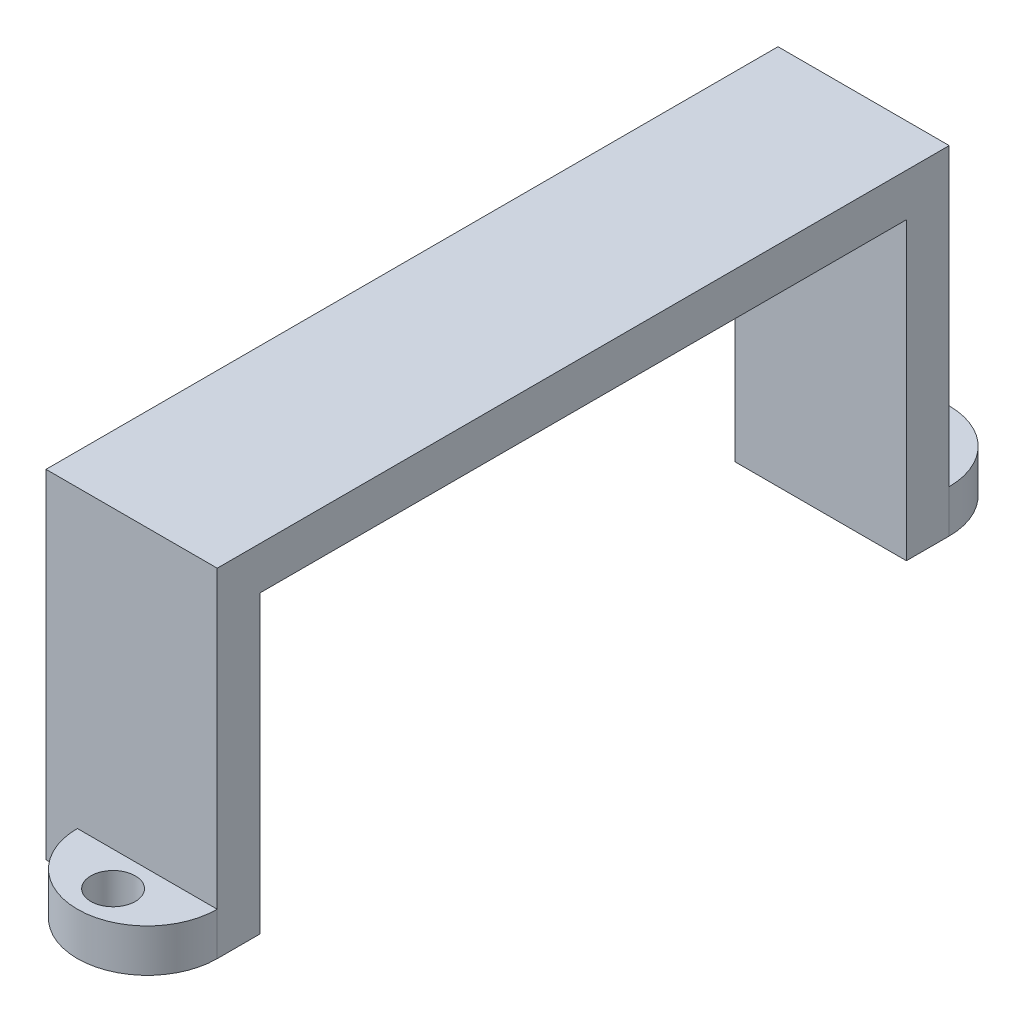
ISO-10303-21;
HEADER;
FILE_DESCRIPTION(('STEP AP214'),'2;1');
FILE_NAME('part.step','',(''),(''),'','','');
FILE_SCHEMA(('AUTOMOTIVE_DESIGN { 1 0 10303 214 1 1 1 1 }'));
ENDSEC;
DATA;
#1=APPLICATION_CONTEXT('core data for automotive mechanical design processes');
#2=APPLICATION_PROTOCOL_DEFINITION('international standard','automotive_design',2000,#1);
#3=PRODUCT_CONTEXT('',#1,'mechanical');
#4=PRODUCT('Part','Part','',(#3));
#5=PRODUCT_RELATED_PRODUCT_CATEGORY('part','',(#4));
#6=PRODUCT_DEFINITION_FORMATION('','',#4);
#7=PRODUCT_DEFINITION_CONTEXT('part definition',#1,'design');
#8=PRODUCT_DEFINITION('design','',#6,#7);
#9=PRODUCT_DEFINITION_SHAPE('','',#8);
#10=(LENGTH_UNIT() NAMED_UNIT(*) SI_UNIT(.MILLI.,.METRE.));
#11=(NAMED_UNIT(*) PLANE_ANGLE_UNIT() SI_UNIT($,.RADIAN.));
#12=(NAMED_UNIT(*) SI_UNIT($,.STERADIAN.) SOLID_ANGLE_UNIT());
#13=UNCERTAINTY_MEASURE_WITH_UNIT(LENGTH_MEASURE(1.E-05),#10,'distance_accuracy_value','');
#14=(GEOMETRIC_REPRESENTATION_CONTEXT(3) GLOBAL_UNCERTAINTY_ASSIGNED_CONTEXT((#13)) GLOBAL_UNIT_ASSIGNED_CONTEXT((#10,
#11,#12)) REPRESENTATION_CONTEXT('',''));
#15=CARTESIAN_POINT('',(0.,0.,0.));
#16=DIRECTION('',(0.,0.,1.));
#17=DIRECTION('',(1.,0.,0.));
#18=AXIS2_PLACEMENT_3D('',#15,#16,#17);
#19=CARTESIAN_POINT('',(0.,17.526,0.));
#20=DIRECTION('',(0.,1.,0.));
#21=DIRECTION('',(0.,0.,1.));
#22=AXIS2_PLACEMENT_3D('',#19,#20,#21);
#23=PLANE('',#22);
#24=DIRECTION('',(-1.,0.,0.));
#25=VECTOR('',#24,1.);
#26=CARTESIAN_POINT('',(-24.2495294117647,17.526,25.0712941176471));
#27=LINE('',#26,#25);
#28=CARTESIAN_POINT('',(-14.0895294117647,17.526,25.0712941176471));
#29=VERTEX_POINT('',#28);
#30=CARTESIAN_POINT('',(-24.2495294117647,17.526,25.0712941176471));
#31=VERTEX_POINT('',#30);
#32=EDGE_CURVE('E170',#29,#31,#27,.T.);
#33=ORIENTED_EDGE('',*,*,#32,.T.);
#34=DIRECTION('',(0.,0.,1.));
#35=VECTOR('',#34,1.);
#36=CARTESIAN_POINT('',(-24.2495294117647,17.526,-15.8227058823529));
#37=LINE('',#36,#35);
#38=CARTESIAN_POINT('',(-24.2495294117647,17.526,-13.2827058823529));
#39=VERTEX_POINT('',#38);
#40=EDGE_CURVE('E187',#39,#31,#37,.T.);
#41=ORIENTED_EDGE('',*,*,#40,.F.);
#42=DIRECTION('',(1.,0.,0.));
#43=VECTOR('',#42,1.);
#44=CARTESIAN_POINT('',(-24.2495294117647,17.526,-13.2827058823529));
#45=LINE('',#44,#43);
#46=CARTESIAN_POINT('',(-14.0895294117647,17.526,-13.2827058823529));
#47=VERTEX_POINT('',#46);
#48=EDGE_CURVE('E129',#39,#47,#45,.T.);
#49=ORIENTED_EDGE('',*,*,#48,.T.);
#50=DIRECTION('',(0.,0.,-1.));
#51=VECTOR('',#50,1.);
#52=CARTESIAN_POINT('',(-14.0895294117647,17.526,-15.8227058823529));
#53=LINE('',#52,#51);
#54=EDGE_CURVE('E37',#29,#47,#53,.T.);
#55=ORIENTED_EDGE('',*,*,#54,.F.);
#56=EDGE_LOOP('',(#33,#41,#49,#55));
#57=FACE_BOUND('',#56,.T.);
#58=ADVANCED_FACE('F33',(#57),#23,.F.);
#59=CARTESIAN_POINT('',(-24.2495294117647,17.526,-15.8227058823529));
#60=DIRECTION('',(1.,0.,0.));
#61=DIRECTION('',(0.,0.,-1.));
#62=AXIS2_PLACEMENT_3D('',#59,#60,#61);
#63=PLANE('',#62);
#64=DIRECTION('',(0.,0.,1.));
#65=VECTOR('',#64,1.);
#66=CARTESIAN_POINT('',(-24.2495294117647,0.,-15.8227058823529));
#67=LINE('',#66,#65);
#68=CARTESIAN_POINT('',(-24.2495294117647,0.,-15.8227058823529));
#69=VERTEX_POINT('',#68);
#70=CARTESIAN_POINT('',(-24.2495294117647,0.,-13.2827058823529));
#71=VERTEX_POINT('',#70);
#72=EDGE_CURVE('E127',#69,#71,#67,.T.);
#73=ORIENTED_EDGE('',*,*,#72,.T.);
#74=DIRECTION('',(0.,-1.,0.));
#75=VECTOR('',#74,1.);
#76=CARTESIAN_POINT('',(-24.2495294117647,17.526,-13.2827058823529));
#77=LINE('',#76,#75);
#78=EDGE_CURVE('E11',#39,#71,#77,.T.);
#79=ORIENTED_EDGE('',*,*,#78,.F.);
#80=ORIENTED_EDGE('',*,*,#40,.T.);
#81=DIRECTION('',(0.,-1.,0.));
#82=VECTOR('',#81,1.);
#83=CARTESIAN_POINT('',(-24.2495294117647,17.526,25.0712941176471));
#84=LINE('',#83,#82);
#85=CARTESIAN_POINT('',(-24.2495294117647,0.,25.0712941176471));
#86=VERTEX_POINT('',#85);
#87=EDGE_CURVE('E173',#31,#86,#84,.T.);
#88=ORIENTED_EDGE('',*,*,#87,.T.);
#89=DIRECTION('',(0.,0.,1.));
#90=VECTOR('',#89,1.);
#91=CARTESIAN_POINT('',(-24.2495294117647,0.,25.0712941176471));
#92=LINE('',#91,#90);
#93=CARTESIAN_POINT('',(-24.2495294117647,0.,27.6112941176471));
#94=VERTEX_POINT('',#93);
#95=EDGE_CURVE('E167',#86,#94,#92,.T.);
#96=ORIENTED_EDGE('',*,*,#95,.T.);
#97=DIRECTION('',(0.,-1.,0.));
#98=VECTOR('',#97,1.);
#99=CARTESIAN_POINT('',(-24.2495294117647,20.066,27.6112941176471));
#100=LINE('',#99,#98);
#101=CARTESIAN_POINT('',(-24.2495294117647,20.066,27.6112941176471));
#102=VERTEX_POINT('',#101);
#103=EDGE_CURVE('E207',#102,#94,#100,.T.);
#104=ORIENTED_EDGE('',*,*,#103,.F.);
#105=DIRECTION('',(0.,0.,1.));
#106=VECTOR('',#105,1.);
#107=CARTESIAN_POINT('',(-24.2495294117647,20.066,-15.8227058823529));
#108=LINE('',#107,#106);
#109=CARTESIAN_POINT('',(-24.2495294117647,20.066,-15.8227058823529));
#110=VERTEX_POINT('',#109);
#111=EDGE_CURVE('E188',#110,#102,#108,.T.);
#112=ORIENTED_EDGE('',*,*,#111,.F.);
#113=DIRECTION('',(0.,-1.,0.));
#114=VECTOR('',#113,1.);
#115=CARTESIAN_POINT('',(-24.2495294117647,17.526,-15.8227058823529));
#116=LINE('',#115,#114);
#117=EDGE_CURVE('E214',#110,#69,#116,.T.);
#118=ORIENTED_EDGE('',*,*,#117,.T.);
#119=EDGE_LOOP('',(#73,#79,#80,#88,#96,#104,#112,#118));
#120=FACE_BOUND('',#119,.T.);
#121=ADVANCED_FACE('F35',(#120),#63,.F.);
#122=CARTESIAN_POINT('',(-24.2495294117647,17.526,-13.2827058823529));
#123=DIRECTION('',(0.,0.,-1.));
#124=DIRECTION('',(-1.,0.,0.));
#125=AXIS2_PLACEMENT_3D('',#122,#123,#124);
#126=PLANE('',#125);
#127=DIRECTION('',(1.,0.,0.));
#128=VECTOR('',#127,1.);
#129=CARTESIAN_POINT('',(-24.2495294117647,0.,-13.2827058823529));
#130=LINE('',#129,#128);
#131=CARTESIAN_POINT('',(-14.0895294117647,0.,-13.2827058823529));
#132=VERTEX_POINT('',#131);
#133=EDGE_CURVE('E223',#71,#132,#130,.T.);
#134=ORIENTED_EDGE('',*,*,#133,.T.);
#135=DIRECTION('',(0.,-1.,0.));
#136=VECTOR('',#135,1.);
#137=CARTESIAN_POINT('',(-14.0895294117647,17.526,-13.2827058823529));
#138=LINE('',#137,#136);
#139=EDGE_CURVE('E43',#47,#132,#138,.T.);
#140=ORIENTED_EDGE('',*,*,#139,.F.);
#141=ORIENTED_EDGE('',*,*,#48,.F.);
#142=ORIENTED_EDGE('',*,*,#78,.T.);
#143=EDGE_LOOP('',(#134,#140,#141,#142));
#144=FACE_BOUND('',#143,.T.);
#145=ADVANCED_FACE('F255',(#144),#126,.F.);
#146=CARTESIAN_POINT('',(-14.0895294117647,17.526,-15.8227058823529));
#147=DIRECTION('',(-1.,0.,0.));
#148=DIRECTION('',(0.,0.,1.));
#149=AXIS2_PLACEMENT_3D('',#146,#147,#148);
#150=PLANE('',#149);
#151=DIRECTION('',(0.,0.,-1.));
#152=VECTOR('',#151,1.);
#153=CARTESIAN_POINT('',(-14.0895294117647,0.,-15.8227058823529));
#154=LINE('',#153,#152);
#155=CARTESIAN_POINT('',(-14.0895294117647,0.,-15.8227058823529));
#156=VERTEX_POINT('',#155);
#157=EDGE_CURVE('E130',#132,#156,#154,.T.);
#158=ORIENTED_EDGE('',*,*,#157,.T.);
#159=DIRECTION('',(0.,-1.,0.));
#160=VECTOR('',#159,1.);
#161=CARTESIAN_POINT('',(-14.0895294117647,2.54,-15.8227058823529));
#162=LINE('',#161,#160);
#163=CARTESIAN_POINT('',(-14.0895294117647,2.54,-15.8227058823529));
#164=VERTEX_POINT('',#163);
#165=EDGE_CURVE('E59',#164,#156,#162,.T.);
#166=ORIENTED_EDGE('',*,*,#165,.F.);
#167=DIRECTION('',(0.,-1.,0.));
#168=VECTOR('',#167,1.);
#169=CARTESIAN_POINT('',(-14.0895294117647,17.526,-15.8227058823529));
#170=LINE('',#169,#168);
#171=CARTESIAN_POINT('',(-14.0895294117647,20.066,-15.8227058823529));
#172=VERTEX_POINT('',#171);
#173=EDGE_CURVE('E220',#172,#164,#170,.T.);
#174=ORIENTED_EDGE('',*,*,#173,.F.);
#175=DIRECTION('',(0.,0.,-1.));
#176=VECTOR('',#175,1.);
#177=CARTESIAN_POINT('',(-14.0895294117647,20.066,-15.8227058823529));
#178=LINE('',#177,#176);
#179=CARTESIAN_POINT('',(-14.0895294117647,20.066,27.6112941176471));
#180=VERTEX_POINT('',#179);
#181=EDGE_CURVE('E193',#180,#172,#178,.T.);
#182=ORIENTED_EDGE('',*,*,#181,.F.);
#183=DIRECTION('',(0.,-1.,0.));
#184=VECTOR('',#183,1.);
#185=CARTESIAN_POINT('',(-14.0895294117647,20.066,27.6112941176471));
#186=LINE('',#185,#184);
#187=CARTESIAN_POINT('',(-14.0895294117647,2.54,27.6112941176471));
#188=VERTEX_POINT('',#187);
#189=EDGE_CURVE('E199',#180,#188,#186,.T.);
#190=ORIENTED_EDGE('',*,*,#189,.T.);
#191=DIRECTION('',(0.,-1.,0.));
#192=VECTOR('',#191,1.);
#193=CARTESIAN_POINT('',(-14.0895294117647,2.54,27.6112941176471));
#194=LINE('',#193,#192);
#195=CARTESIAN_POINT('',(-14.0895294117647,0.,27.6112941176471));
#196=VERTEX_POINT('',#195);
#197=EDGE_CURVE('E164',#188,#196,#194,.T.);
#198=ORIENTED_EDGE('',*,*,#197,.T.);
#199=DIRECTION('',(0.,0.,-1.));
#200=VECTOR('',#199,1.);
#201=CARTESIAN_POINT('',(-14.0895294117647,0.,25.0712941176471));
#202=LINE('',#201,#200);
#203=CARTESIAN_POINT('',(-14.0895294117647,0.,25.0712941176471));
#204=VERTEX_POINT('',#203);
#205=EDGE_CURVE('E179',#196,#204,#202,.T.);
#206=ORIENTED_EDGE('',*,*,#205,.T.);
#207=DIRECTION('',(0.,-1.,0.));
#208=VECTOR('',#207,1.);
#209=CARTESIAN_POINT('',(-14.0895294117647,17.526,25.0712941176471));
#210=LINE('',#209,#208);
#211=EDGE_CURVE('E184',#29,#204,#210,.T.);
#212=ORIENTED_EDGE('',*,*,#211,.F.);
#213=ORIENTED_EDGE('',*,*,#54,.T.);
#214=ORIENTED_EDGE('',*,*,#139,.T.);
#215=EDGE_LOOP('',(#158,#166,#174,#182,#190,#198,#206,#212,#213,#214));
#216=FACE_BOUND('',#215,.T.);
#217=ADVANCED_FACE('F235',(#216),#150,.F.);
#218=CARTESIAN_POINT('',(-24.2495294117647,17.526,-15.8227058823529));
#219=DIRECTION('',(0.,0.,1.));
#220=DIRECTION('',(1.,0.,0.));
#221=AXIS2_PLACEMENT_3D('',#218,#219,#220);
#222=PLANE('',#221);
#223=DIRECTION('',(-1.,0.,0.));
#224=VECTOR('',#223,1.);
#225=CARTESIAN_POINT('',(-22.3866283737024,2.54,-15.8227058823529));
#226=LINE('',#225,#224);
#227=CARTESIAN_POINT('',(-22.3866283737024,2.54,-15.8227058823529));
#228=VERTEX_POINT('',#227);
#229=EDGE_CURVE('E51',#164,#228,#226,.T.);
#230=ORIENTED_EDGE('',*,*,#229,.T.);
#231=DIRECTION('',(0.,-1.,0.));
#232=VECTOR('',#231,1.);
#233=CARTESIAN_POINT('',(-22.3866283737024,2.54,-15.8227058823529));
#234=LINE('',#233,#232);
#235=CARTESIAN_POINT('',(-22.3866283737024,0.,-15.8227058823529));
#236=VERTEX_POINT('',#235);
#237=EDGE_CURVE('E132',#228,#236,#234,.T.);
#238=ORIENTED_EDGE('',*,*,#237,.T.);
#239=DIRECTION('',(-1.,0.,0.));
#240=VECTOR('',#239,1.);
#241=CARTESIAN_POINT('',(-24.2495294117647,0.,-15.8227058823529));
#242=LINE('',#241,#240);
#243=EDGE_CURVE('E120',#236,#69,#242,.T.);
#244=ORIENTED_EDGE('',*,*,#243,.T.);
#245=ORIENTED_EDGE('',*,*,#117,.F.);
#246=DIRECTION('',(-1.,0.,0.));
#247=VECTOR('',#246,1.);
#248=CARTESIAN_POINT('',(-24.2495294117647,20.066,-15.8227058823529));
#249=LINE('',#248,#247);
#250=EDGE_CURVE('E196',#172,#110,#249,.T.);
#251=ORIENTED_EDGE('',*,*,#250,.F.);
#252=ORIENTED_EDGE('',*,*,#173,.T.);
#253=EDGE_LOOP('',(#230,#238,#244,#245,#251,#252));
#254=FACE_BOUND('',#253,.T.);
#255=ADVANCED_FACE('F133',(#254),#222,.F.);
#256=CARTESIAN_POINT('',(0.,0.,0.));
#257=DIRECTION('',(0.,1.,0.));
#258=DIRECTION('',(0.,0.,1.));
#259=AXIS2_PLACEMENT_3D('',#256,#257,#258);
#260=PLANE('',#259);
#261=ORIENTED_EDGE('',*,*,#72,.F.);
#262=ORIENTED_EDGE('',*,*,#243,.F.);
#263=CARTESIAN_POINT('',(-18.2380788927335,0.,-15.8227058823529));
#264=DIRECTION('',(0.,-1.,0.));
#265=DIRECTION('',(0.,0.,1.));
#266=AXIS2_PLACEMENT_3D('',#263,#264,#265);
#267=CIRCLE('',#266,4.14854948096886);
#268=EDGE_CURVE('E125',#236,#156,#267,.T.);
#269=ORIENTED_EDGE('',*,*,#268,.T.);
#270=ORIENTED_EDGE('',*,*,#157,.F.);
#271=ORIENTED_EDGE('',*,*,#133,.F.);
#272=EDGE_LOOP('',(#261,#262,#269,#270,#271));
#273=FACE_BOUND('',#272,.T.);
#274=CARTESIAN_POINT('',(-18.2380788927335,0.,-17.8547058823529));
#275=DIRECTION('',(0.,-1.,0.));
#276=DIRECTION('',(0.,0.,-1.));
#277=AXIS2_PLACEMENT_3D('',#274,#275,#276);
#278=CIRCLE('',#277,1.34985912951486);
#279=CARTESIAN_POINT('',(-18.2380788927335,0.,-19.2045650118678));
#280=VERTEX_POINT('',#279);
#281=EDGE_CURVE('E145',#280,#280,#278,.T.);
#282=ORIENTED_EDGE('',*,*,#281,.F.);
#283=EDGE_LOOP('',(#282));
#284=FACE_BOUND('',#283,.T.);
#285=ADVANCED_FACE('F121',(#273,#284),#260,.F.);
#286=CARTESIAN_POINT('',(-24.2495294117647,20.066,27.6112941176471));
#287=DIRECTION('',(0.,0.,-1.));
#288=DIRECTION('',(-1.,0.,0.));
#289=AXIS2_PLACEMENT_3D('',#286,#287,#288);
#290=PLANE('',#289);
#291=DIRECTION('',(1.,0.,0.));
#292=VECTOR('',#291,1.);
#293=CARTESIAN_POINT('',(-24.2495294117647,0.,27.6112941176471));
#294=LINE('',#293,#292);
#295=CARTESIAN_POINT('',(-22.3866283737024,0.,27.6112941176471));
#296=VERTEX_POINT('',#295);
#297=EDGE_CURVE('E177',#94,#296,#294,.T.);
#298=ORIENTED_EDGE('',*,*,#297,.T.);
#299=DIRECTION('',(0.,-1.,0.));
#300=VECTOR('',#299,1.);
#301=CARTESIAN_POINT('',(-22.3866283737024,2.54,27.6112941176471));
#302=LINE('',#301,#300);
#303=CARTESIAN_POINT('',(-22.3866283737024,2.54,27.6112941176471));
#304=VERTEX_POINT('',#303);
#305=EDGE_CURVE('E161',#304,#296,#302,.T.);
#306=ORIENTED_EDGE('',*,*,#305,.F.);
#307=DIRECTION('',(1.,0.,0.));
#308=VECTOR('',#307,1.);
#309=CARTESIAN_POINT('',(-22.3866283737024,2.54,27.6112941176471));
#310=LINE('',#309,#308);
#311=EDGE_CURVE('E159',#304,#188,#310,.T.);
#312=ORIENTED_EDGE('',*,*,#311,.T.);
#313=ORIENTED_EDGE('',*,*,#189,.F.);
#314=DIRECTION('',(1.,0.,0.));
#315=VECTOR('',#314,1.);
#316=CARTESIAN_POINT('',(-24.2495294117647,20.066,27.6112941176471));
#317=LINE('',#316,#315);
#318=EDGE_CURVE('E191',#102,#180,#317,.T.);
#319=ORIENTED_EDGE('',*,*,#318,.F.);
#320=ORIENTED_EDGE('',*,*,#103,.T.);
#321=EDGE_LOOP('',(#298,#306,#312,#313,#319,#320));
#322=FACE_BOUND('',#321,.T.);
#323=ADVANCED_FACE('F243',(#322),#290,.F.);
#324=CARTESIAN_POINT('',(0.,20.066,0.));
#325=DIRECTION('',(0.,1.,0.));
#326=DIRECTION('',(0.,0.,1.));
#327=AXIS2_PLACEMENT_3D('',#324,#325,#326);
#328=PLANE('',#327);
#329=ORIENTED_EDGE('',*,*,#111,.T.);
#330=ORIENTED_EDGE('',*,*,#318,.T.);
#331=ORIENTED_EDGE('',*,*,#181,.T.);
#332=ORIENTED_EDGE('',*,*,#250,.T.);
#333=EDGE_LOOP('',(#329,#330,#331,#332));
#334=FACE_BOUND('',#333,.T.);
#335=ADVANCED_FACE('F258',(#334),#328,.T.);
#336=CARTESIAN_POINT('',(-24.2495294117647,17.526,25.0712941176471));
#337=DIRECTION('',(0.,0.,1.));
#338=DIRECTION('',(1.,0.,0.));
#339=AXIS2_PLACEMENT_3D('',#336,#337,#338);
#340=PLANE('',#339);
#341=DIRECTION('',(-1.,0.,0.));
#342=VECTOR('',#341,1.);
#343=CARTESIAN_POINT('',(-24.2495294117647,0.,25.0712941176471));
#344=LINE('',#343,#342);
#345=EDGE_CURVE('E174',#204,#86,#344,.T.);
#346=ORIENTED_EDGE('',*,*,#345,.T.);
#347=ORIENTED_EDGE('',*,*,#87,.F.);
#348=ORIENTED_EDGE('',*,*,#32,.F.);
#349=ORIENTED_EDGE('',*,*,#211,.T.);
#350=EDGE_LOOP('',(#346,#347,#348,#349));
#351=FACE_BOUND('',#350,.T.);
#352=ADVANCED_FACE('F251',(#351),#340,.F.);
#353=CARTESIAN_POINT('',(0.,0.,0.));
#354=DIRECTION('',(0.,1.,0.));
#355=DIRECTION('',(0.,0.,1.));
#356=AXIS2_PLACEMENT_3D('',#353,#354,#355);
#357=PLANE('',#356);
#358=ORIENTED_EDGE('',*,*,#95,.F.);
#359=ORIENTED_EDGE('',*,*,#345,.F.);
#360=ORIENTED_EDGE('',*,*,#205,.F.);
#361=CARTESIAN_POINT('',(-18.2380788927335,0.,27.6112941176471));
#362=DIRECTION('',(0.,-1.,0.));
#363=DIRECTION('',(0.,0.,-1.));
#364=AXIS2_PLACEMENT_3D('',#361,#362,#363);
#365=CIRCLE('',#364,4.14854948096886);
#366=EDGE_CURVE('E153',#196,#296,#365,.T.);
#367=ORIENTED_EDGE('',*,*,#366,.T.);
#368=ORIENTED_EDGE('',*,*,#297,.F.);
#369=EDGE_LOOP('',(#358,#359,#360,#367,#368));
#370=FACE_BOUND('',#369,.T.);
#371=CARTESIAN_POINT('',(-18.2380788927335,0.,29.6432941176471));
#372=DIRECTION('',(0.,-1.,0.));
#373=DIRECTION('',(0.,0.,-1.));
#374=AXIS2_PLACEMENT_3D('',#371,#372,#373);
#375=CIRCLE('',#374,1.31952267193916);
#376=CARTESIAN_POINT('',(-18.2380788927335,0.,28.3237714457079));
#377=VERTEX_POINT('',#376);
#378=EDGE_CURVE('E137',#377,#377,#375,.T.);
#379=ORIENTED_EDGE('',*,*,#378,.F.);
#380=EDGE_LOOP('',(#379));
#381=FACE_BOUND('',#380,.T.);
#382=ADVANCED_FACE('F246',(#370,#381),#357,.F.);
#383=CARTESIAN_POINT('',(-18.2380788927335,2.54,27.6112941176471));
#384=DIRECTION('',(0.,-1.,0.));
#385=DIRECTION('',(0.,0.,-1.));
#386=AXIS2_PLACEMENT_3D('',#383,#384,#385);
#387=CYLINDRICAL_SURFACE('',#386,4.14854948096886);
#388=ORIENTED_EDGE('',*,*,#366,.F.);
#389=ORIENTED_EDGE('',*,*,#197,.F.);
#390=CARTESIAN_POINT('',(-18.2380788927335,2.54,27.6112941176471));
#391=DIRECTION('',(0.,-1.,0.));
#392=DIRECTION('',(0.,0.,-1.));
#393=AXIS2_PLACEMENT_3D('',#390,#391,#392);
#394=CIRCLE('',#393,4.14854948096886);
#395=EDGE_CURVE('E156',#188,#304,#394,.T.);
#396=ORIENTED_EDGE('',*,*,#395,.T.);
#397=ORIENTED_EDGE('',*,*,#305,.T.);
#398=EDGE_LOOP('',(#388,#389,#396,#397));
#399=FACE_BOUND('',#398,.T.);
#400=ADVANCED_FACE('F239',(#399),#387,.T.);
#401=CARTESIAN_POINT('',(-18.2380788927335,2.54,27.6112941176471));
#402=DIRECTION('',(0.,-1.,0.));
#403=DIRECTION('',(0.,0.,-1.));
#404=AXIS2_PLACEMENT_3D('',#401,#402,#403);
#405=PLANE('',#404);
#406=CARTESIAN_POINT('',(-18.2380788927335,2.54,29.6432941176471));
#407=DIRECTION('',(0.,-1.,0.));
#408=DIRECTION('',(0.,0.,-1.));
#409=AXIS2_PLACEMENT_3D('',#406,#407,#408);
#410=CIRCLE('',#409,1.31952267193916);
#411=CARTESIAN_POINT('',(-18.2380788927335,2.54,28.3237714457079));
#412=VERTEX_POINT('',#411);
#413=EDGE_CURVE('E150',#412,#412,#410,.T.);
#414=ORIENTED_EDGE('',*,*,#413,.T.);
#415=EDGE_LOOP('',(#414));
#416=FACE_BOUND('',#415,.T.);
#417=ORIENTED_EDGE('',*,*,#395,.F.);
#418=ORIENTED_EDGE('',*,*,#311,.F.);
#419=EDGE_LOOP('',(#417,#418));
#420=FACE_BOUND('',#419,.T.);
#421=ADVANCED_FACE('F242',(#416,#420),#405,.F.);
#422=CARTESIAN_POINT('',(-18.2380788927335,2.54,29.6432941176471));
#423=DIRECTION('',(0.,-1.,0.));
#424=DIRECTION('',(0.,0.,-1.));
#425=AXIS2_PLACEMENT_3D('',#422,#423,#424);
#426=CYLINDRICAL_SURFACE('',#425,1.31952267193916);
#427=ORIENTED_EDGE('',*,*,#413,.F.);
#428=EDGE_LOOP('',(#427));
#429=FACE_BOUND('',#428,.T.);
#430=ORIENTED_EDGE('',*,*,#378,.T.);
#431=EDGE_LOOP('',(#430));
#432=FACE_BOUND('',#431,.T.);
#433=ADVANCED_FACE('F272',(#429,#432),#426,.F.);
#434=CARTESIAN_POINT('',(-18.2380788927335,2.54,-15.8227058823529));
#435=DIRECTION('',(0.,-1.,0.));
#436=DIRECTION('',(0.,0.,-1.));
#437=AXIS2_PLACEMENT_3D('',#434,#435,#436);
#438=CYLINDRICAL_SURFACE('',#437,4.14854948096886);
#439=ORIENTED_EDGE('',*,*,#268,.F.);
#440=ORIENTED_EDGE('',*,*,#237,.F.);
#441=CARTESIAN_POINT('',(-18.2380788927335,2.54,-15.8227058823529));
#442=DIRECTION('',(0.,-1.,0.));
#443=DIRECTION('',(0.,0.,1.));
#444=AXIS2_PLACEMENT_3D('',#441,#442,#443);
#445=CIRCLE('',#444,4.14854948096886);
#446=EDGE_CURVE('E140',#228,#164,#445,.T.);
#447=ORIENTED_EDGE('',*,*,#446,.T.);
#448=ORIENTED_EDGE('',*,*,#165,.T.);
#449=EDGE_LOOP('',(#439,#440,#447,#448));
#450=FACE_BOUND('',#449,.T.);
#451=ADVANCED_FACE('F139',(#450),#438,.T.);
#452=CARTESIAN_POINT('',(-18.2380788927335,2.54,-15.8227058823529));
#453=DIRECTION('',(0.,1.,0.));
#454=DIRECTION('',(0.,0.,1.));
#455=AXIS2_PLACEMENT_3D('',#452,#453,#454);
#456=PLANE('',#455);
#457=CARTESIAN_POINT('',(-18.2380788927335,2.54,-17.8547058823529));
#458=DIRECTION('',(0.,-1.,0.));
#459=DIRECTION('',(0.,0.,-1.));
#460=AXIS2_PLACEMENT_3D('',#457,#458,#459);
#461=CIRCLE('',#460,1.34985912951486);
#462=CARTESIAN_POINT('',(-18.2380788927335,2.54,-19.2045650118678));
#463=VERTEX_POINT('',#462);
#464=EDGE_CURVE('E141',#463,#463,#461,.T.);
#465=ORIENTED_EDGE('',*,*,#464,.T.);
#466=EDGE_LOOP('',(#465));
#467=FACE_BOUND('',#466,.T.);
#468=ORIENTED_EDGE('',*,*,#446,.F.);
#469=ORIENTED_EDGE('',*,*,#229,.F.);
#470=EDGE_LOOP('',(#468,#469));
#471=FACE_BOUND('',#470,.T.);
#472=ADVANCED_FACE('F261',(#467,#471),#456,.T.);
#473=CARTESIAN_POINT('',(-18.2380788927335,2.54,-17.8547058823529));
#474=DIRECTION('',(0.,-1.,0.));
#475=DIRECTION('',(0.,0.,-1.));
#476=AXIS2_PLACEMENT_3D('',#473,#474,#475);
#477=CYLINDRICAL_SURFACE('',#476,1.34985912951486);
#478=ORIENTED_EDGE('',*,*,#464,.F.);
#479=EDGE_LOOP('',(#478));
#480=FACE_BOUND('',#479,.T.);
#481=ORIENTED_EDGE('',*,*,#281,.T.);
#482=EDGE_LOOP('',(#481));
#483=FACE_BOUND('',#482,.T.);
#484=ADVANCED_FACE('F263',(#480,#483),#477,.F.);
#485=CLOSED_SHELL('',(#58,#121,#145,#217,#255,#285,#323,#335,#352,#382,#400,#421,#433,#451,#472,#484));
#486=MANIFOLD_SOLID_BREP('B2',#485);
#487=ADVANCED_BREP_SHAPE_REPRESENTATION('',(#18,#486),#14);
#488=SHAPE_DEFINITION_REPRESENTATION(#9,#487);
ENDSEC;
END-ISO-10303-21;
